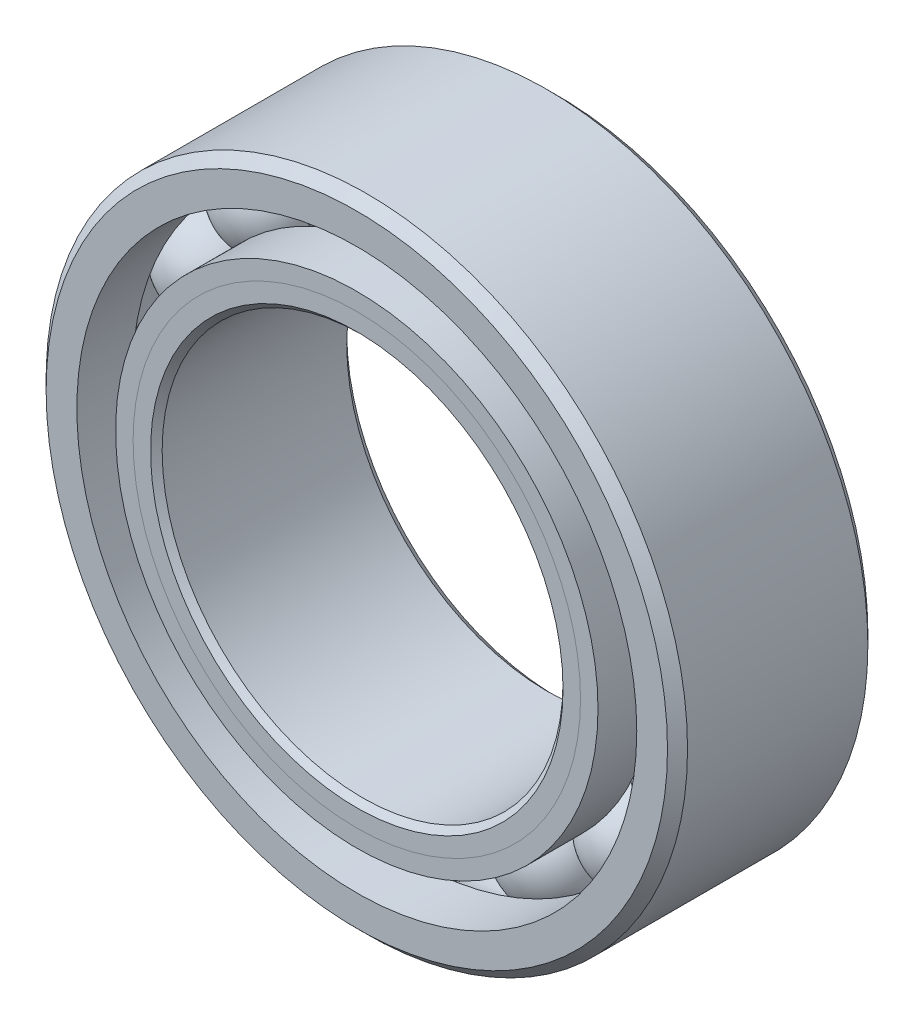
ISO-10303-21;
HEADER;
FILE_DESCRIPTION(('STEP AP214'),'2;1');
FILE_NAME('part.step','',(''),(''),'','','');
FILE_SCHEMA(('AUTOMOTIVE_DESIGN { 1 0 10303 214 1 1 1 1 }'));
ENDSEC;
DATA;
#1=APPLICATION_CONTEXT('core data for automotive mechanical design processes');
#2=APPLICATION_PROTOCOL_DEFINITION('international standard','automotive_design',2000,#1);
#3=PRODUCT_CONTEXT('',#1,'mechanical');
#4=PRODUCT('Part','Part','',(#3));
#5=PRODUCT_RELATED_PRODUCT_CATEGORY('part','',(#4));
#6=PRODUCT_DEFINITION_FORMATION('','',#4);
#7=PRODUCT_DEFINITION_CONTEXT('part definition',#1,'design');
#8=PRODUCT_DEFINITION('design','',#6,#7);
#9=PRODUCT_DEFINITION_SHAPE('','',#8);
#10=(LENGTH_UNIT() NAMED_UNIT(*) SI_UNIT(.MILLI.,.METRE.));
#11=(NAMED_UNIT(*) PLANE_ANGLE_UNIT() SI_UNIT($,.RADIAN.));
#12=(NAMED_UNIT(*) SI_UNIT($,.STERADIAN.) SOLID_ANGLE_UNIT());
#13=UNCERTAINTY_MEASURE_WITH_UNIT(LENGTH_MEASURE(1.E-05),#10,'distance_accuracy_value','');
#14=(GEOMETRIC_REPRESENTATION_CONTEXT(3) GLOBAL_UNCERTAINTY_ASSIGNED_CONTEXT((#13)) GLOBAL_UNIT_ASSIGNED_CONTEXT((#10,
#11,#12)) REPRESENTATION_CONTEXT('',''));
#15=CARTESIAN_POINT('',(0.,0.,0.));
#16=DIRECTION('',(0.,0.,1.));
#17=DIRECTION('',(1.,0.,0.));
#18=AXIS2_PLACEMENT_3D('',#15,#16,#17);
#19=CARTESIAN_POINT('',(-1.97440733385857,4.76664096305045,0.));
#20=DIRECTION('',(0.,0.,1.));
#21=DIRECTION('',(0.382683432365077,-0.923879532511292,0.));
#22=AXIS2_PLACEMENT_3D('',#19,#20,#21);
#23=SPHERICAL_SURFACE('',#22,0.961595974831125);
#24=CARTESIAN_POINT('',(-1.97440733385857,4.76664096305045,0.961595974831125));
#25=VERTEX_POINT('',#24);
#26=VERTEX_LOOP('',#25);
#27=FACE_BOUND('',#26,.T.);
#28=ADVANCED_FACE('F39',(#27),#23,.T.);
#29=CLOSED_SHELL('',(#28));
#30=MANIFOLD_SOLID_BREP('B2',#29);
#31=CARTESIAN_POINT('',(-3.6482290491843,3.64822904918439,0.));
#32=DIRECTION('',(0.,0.,1.));
#33=DIRECTION('',(0.707106781186539,-0.707106781186556,0.));
#34=AXIS2_PLACEMENT_3D('',#31,#32,#33);
#35=SPHERICAL_SURFACE('',#34,0.961595974831125);
#36=CARTESIAN_POINT('',(-3.6482290491843,3.64822904918439,0.961595974831125));
#37=VERTEX_POINT('',#36);
#38=VERTEX_LOOP('',#37);
#39=FACE_BOUND('',#38,.T.);
#40=ADVANCED_FACE('F59',(#39),#35,.T.);
#41=CLOSED_SHELL('',(#40));
#42=MANIFOLD_SOLID_BREP('B6',#41);
#43=CARTESIAN_POINT('',(-4.7666409630504,1.97440733385869,0.));
#44=DIRECTION('',(0.,0.,1.));
#45=DIRECTION('',(0.923879532511283,-0.3826834323651,0.));
#46=AXIS2_PLACEMENT_3D('',#43,#44,#45);
#47=SPHERICAL_SURFACE('',#46,0.961595974831125);
#48=CARTESIAN_POINT('',(-4.7666409630504,1.97440733385869,0.961595974831125));
#49=VERTEX_POINT('',#48);
#50=VERTEX_LOOP('',#49);
#51=FACE_BOUND('',#50,.T.);
#52=ADVANCED_FACE('F79',(#51),#47,.T.);
#53=CLOSED_SHELL('',(#52));
#54=MANIFOLD_SOLID_BREP('B35',#53);
#55=CARTESIAN_POINT('',(-5.159375,0.,0.));
#56=DIRECTION('',(0.,0.,1.));
#57=DIRECTION('',(1.,0.,0.));
#58=AXIS2_PLACEMENT_3D('',#55,#56,#57);
#59=SPHERICAL_SURFACE('',#58,0.961595974831125);
#60=CARTESIAN_POINT('',(-5.159375,0.,0.961595974831125));
#61=VERTEX_POINT('',#60);
#62=VERTEX_LOOP('',#61);
#63=FACE_BOUND('',#62,.T.);
#64=ADVANCED_FACE('F99',(#63),#59,.T.);
#65=CLOSED_SHELL('',(#64));
#66=MANIFOLD_SOLID_BREP('B55',#65);
#67=CARTESIAN_POINT('',(-4.76664096305044,-1.97440733385859,0.));
#68=DIRECTION('',(0.,0.,1.));
#69=DIRECTION('',(0.923879532511291,0.382683432365081,0.));
#70=AXIS2_PLACEMENT_3D('',#67,#68,#69);
#71=SPHERICAL_SURFACE('',#70,0.961595974831125);
#72=CARTESIAN_POINT('',(-4.76664096305044,-1.97440733385859,0.961595974831125));
#73=VERTEX_POINT('',#72);
#74=VERTEX_LOOP('',#73);
#75=FACE_BOUND('',#74,.T.);
#76=ADVANCED_FACE('F119',(#75),#71,.T.);
#77=CLOSED_SHELL('',(#76));
#78=MANIFOLD_SOLID_BREP('B75',#77);
#79=CARTESIAN_POINT('',(-3.64822904918437,-3.64822904918431,0.));
#80=DIRECTION('',(0.,0.,1.));
#81=DIRECTION('',(0.707106781186554,0.707106781186541,0.));
#82=AXIS2_PLACEMENT_3D('',#79,#80,#81);
#83=SPHERICAL_SURFACE('',#82,0.961595974831125);
#84=CARTESIAN_POINT('',(-3.64822904918437,-3.64822904918431,0.961595974831125));
#85=VERTEX_POINT('',#84);
#86=VERTEX_LOOP('',#85);
#87=FACE_BOUND('',#86,.T.);
#88=ADVANCED_FACE('F151',(#87),#83,.T.);
#89=CLOSED_SHELL('',(#88));
#90=MANIFOLD_SOLID_BREP('B95',#89);
#91=CARTESIAN_POINT('',(-1.97440733385867,-4.7666409630504,0.));
#92=DIRECTION('',(0.,0.,1.));
#93=DIRECTION('',(0.382683432365097,0.923879532511284,0.));
#94=AXIS2_PLACEMENT_3D('',#91,#92,#93);
#95=SPHERICAL_SURFACE('',#94,0.961595974831125);
#96=CARTESIAN_POINT('',(-1.97440733385867,-4.7666409630504,0.961595974831125));
#97=VERTEX_POINT('',#96);
#98=VERTEX_LOOP('',#97);
#99=FACE_BOUND('',#98,.T.);
#100=ADVANCED_FACE('F181',(#99),#95,.T.);
#101=CLOSED_SHELL('',(#100));
#102=MANIFOLD_SOLID_BREP('B115',#101);
#103=CARTESIAN_POINT('',(0.,-5.159375,0.));
#104=DIRECTION('',(0.,0.,1.));
#105=DIRECTION('',(0.,1.,0.));
#106=AXIS2_PLACEMENT_3D('',#103,#104,#105);
#107=SPHERICAL_SURFACE('',#106,0.961595974831125);
#108=CARTESIAN_POINT('',(0.,-5.159375,0.961595974831125));
#109=VERTEX_POINT('',#108);
#110=VERTEX_LOOP('',#109);
#111=FACE_BOUND('',#110,.T.);
#112=ADVANCED_FACE('F213',(#111),#107,.T.);
#113=CLOSED_SHELL('',(#112));
#114=MANIFOLD_SOLID_BREP('B147',#113);
#115=CARTESIAN_POINT('',(1.97440733385861,-4.76664096305043,0.));
#116=DIRECTION('',(0.,0.,1.));
#117=DIRECTION('',(-0.382683432365084,0.923879532511289,0.));
#118=AXIS2_PLACEMENT_3D('',#115,#116,#117);
#119=SPHERICAL_SURFACE('',#118,0.961595974831125);
#120=CARTESIAN_POINT('',(1.97440733385861,-4.76664096305043,0.961595974831125));
#121=VERTEX_POINT('',#120);
#122=VERTEX_LOOP('',#121);
#123=FACE_BOUND('',#122,.T.);
#124=ADVANCED_FACE('F245',(#123),#119,.T.);
#125=CLOSED_SHELL('',(#124));
#126=MANIFOLD_SOLID_BREP('B177',#125);
#127=CARTESIAN_POINT('',(3.64822904918432,-3.64822904918436,0.));
#128=DIRECTION('',(0.,0.,1.));
#129=DIRECTION('',(-0.707106781186544,0.707106781186551,0.));
#130=AXIS2_PLACEMENT_3D('',#127,#128,#129);
#131=SPHERICAL_SURFACE('',#130,0.961595974831125);
#132=CARTESIAN_POINT('',(3.64822904918432,-3.64822904918436,0.961595974831125));
#133=VERTEX_POINT('',#132);
#134=VERTEX_LOOP('',#133);
#135=FACE_BOUND('',#134,.T.);
#136=ADVANCED_FACE('F277',(#135),#131,.T.);
#137=CLOSED_SHELL('',(#136));
#138=MANIFOLD_SOLID_BREP('B209',#137);
#139=CARTESIAN_POINT('',(4.76664096305041,-1.97440733385866,0.));
#140=DIRECTION('',(0.,0.,1.));
#141=DIRECTION('',(-0.923879532511285,0.382683432365094,0.));
#142=AXIS2_PLACEMENT_3D('',#139,#140,#141);
#143=SPHERICAL_SURFACE('',#142,0.961595974831125);
#144=CARTESIAN_POINT('',(4.76664096305041,-1.97440733385866,0.961595974831125));
#145=VERTEX_POINT('',#144);
#146=VERTEX_LOOP('',#145);
#147=FACE_BOUND('',#146,.T.);
#148=ADVANCED_FACE('F307',(#147),#143,.T.);
#149=CLOSED_SHELL('',(#148));
#150=MANIFOLD_SOLID_BREP('B241',#149);
#151=CARTESIAN_POINT('',(5.159375,0.,0.));
#152=DIRECTION('',(0.,0.,1.));
#153=DIRECTION('',(-1.,0.,0.));
#154=AXIS2_PLACEMENT_3D('',#151,#152,#153);
#155=SPHERICAL_SURFACE('',#154,0.961595974831125);
#156=CARTESIAN_POINT('',(5.159375,0.,0.961595974831125));
#157=VERTEX_POINT('',#156);
#158=VERTEX_LOOP('',#157);
#159=FACE_BOUND('',#158,.T.);
#160=ADVANCED_FACE('F339',(#159),#155,.T.);
#161=CLOSED_SHELL('',(#160));
#162=MANIFOLD_SOLID_BREP('B273',#161);
#163=CARTESIAN_POINT('',(4.76664096305042,1.97440733385862,0.));
#164=DIRECTION('',(0.,0.,1.));
#165=DIRECTION('',(-0.923879532511288,-0.382683432365087,0.));
#166=AXIS2_PLACEMENT_3D('',#163,#164,#165);
#167=SPHERICAL_SURFACE('',#166,0.961595974831125);
#168=CARTESIAN_POINT('',(4.76664096305042,1.97440733385862,0.961595974831125));
#169=VERTEX_POINT('',#168);
#170=VERTEX_LOOP('',#169);
#171=FACE_BOUND('',#170,.T.);
#172=ADVANCED_FACE('F369',(#171),#167,.T.);
#173=CLOSED_SHELL('',(#172));
#174=MANIFOLD_SOLID_BREP('B303',#173);
#175=CARTESIAN_POINT('',(3.64822904918435,3.64822904918434,0.));
#176=DIRECTION('',(0.,0.,1.));
#177=DIRECTION('',(-0.707106781186549,-0.707106781186546,0.));
#178=AXIS2_PLACEMENT_3D('',#175,#176,#177);
#179=SPHERICAL_SURFACE('',#178,0.961595974831125);
#180=CARTESIAN_POINT('',(3.64822904918435,3.64822904918434,0.961595974831125));
#181=VERTEX_POINT('',#180);
#182=VERTEX_LOOP('',#181);
#183=FACE_BOUND('',#182,.T.);
#184=ADVANCED_FACE('F401',(#183),#179,.T.);
#185=CLOSED_SHELL('',(#184));
#186=MANIFOLD_SOLID_BREP('B335',#185);
#187=CARTESIAN_POINT('',(1.97440733385864,4.76664096305042,0.));
#188=DIRECTION('',(0.,0.,1.));
#189=DIRECTION('',(-0.382683432365091,-0.923879532511287,0.));
#190=AXIS2_PLACEMENT_3D('',#187,#188,#189);
#191=SPHERICAL_SURFACE('',#190,0.961595974831125);
#192=CARTESIAN_POINT('',(1.97440733385864,4.76664096305042,0.961595974831125));
#193=VERTEX_POINT('',#192);
#194=VERTEX_LOOP('',#193);
#195=FACE_BOUND('',#194,.T.);
#196=ADVANCED_FACE('F431',(#195),#191,.T.);
#197=CLOSED_SHELL('',(#196));
#198=MANIFOLD_SOLID_BREP('B365',#197);
#199=CARTESIAN_POINT('',(0.,5.159375,0.));
#200=DIRECTION('',(0.,0.,1.));
#201=DIRECTION('',(0.,-1.,0.));
#202=AXIS2_PLACEMENT_3D('',#199,#200,#201);
#203=SPHERICAL_SURFACE('',#202,0.961595974831125);
#204=CARTESIAN_POINT('',(0.,5.159375,0.961595974831125));
#205=VERTEX_POINT('',#204);
#206=VERTEX_LOOP('',#205);
#207=FACE_BOUND('',#206,.T.);
#208=ADVANCED_FACE('F463',(#207),#203,.T.);
#209=CLOSED_SHELL('',(#208));
#210=MANIFOLD_SOLID_BREP('B397',#209);
#211=CARTESIAN_POINT('',(0.,4.4293962398087,1.98374));
#212=DIRECTION('',(0.,0.,-1.));
#213=DIRECTION('',(-1.,0.,0.));
#214=AXIS2_PLACEMENT_3D('',#211,#212,#213);
#215=PLANE('',#214);
#216=CARTESIAN_POINT('',(0.,0.,1.98374));
#217=DIRECTION('',(0.,0.,1.));
#218=DIRECTION('',(1.,0.,0.));
#219=AXIS2_PLACEMENT_3D('',#216,#217,#218);
#220=CIRCLE('',#219,4.08326451258444);
#221=CARTESIAN_POINT('',(4.08326451258444,0.,1.98374));
#222=VERTEX_POINT('',#221);
#223=EDGE_CURVE('E517',#222,#222,#220,.T.);
#224=ORIENTED_EDGE('',*,*,#223,.F.);
#225=EDGE_LOOP('',(#224));
#226=FACE_BOUND('',#225,.T.);
#227=CARTESIAN_POINT('',(0.,0.,1.98374));
#228=DIRECTION('',(0.,0.,1.));
#229=DIRECTION('',(1.,0.,0.));
#230=AXIS2_PLACEMENT_3D('',#227,#228,#229);
#231=CIRCLE('',#230,4.4293962398087);
#232=CARTESIAN_POINT('',(4.4293962398087,0.,1.98374));
#233=VERTEX_POINT('',#232);
#234=EDGE_CURVE('E462',#233,#233,#231,.T.);
#235=ORIENTED_EDGE('',*,*,#234,.T.);
#236=EDGE_LOOP('',(#235));
#237=FACE_BOUND('',#236,.T.);
#238=ADVANCED_FACE('F483',(#226,#237),#215,.F.);
#239=CARTESIAN_POINT('',(0.,0.,1.63760827277574));
#240=DIRECTION('',(0.,0.,1.));
#241=DIRECTION('',(1.,0.,0.));
#242=AXIS2_PLACEMENT_3D('',#239,#240,#241);
#243=CONICAL_SURFACE('',#242,4.08326451258444,0.785398163397451);
#244=ORIENTED_EDGE('',*,*,#234,.F.);
#245=EDGE_LOOP('',(#244));
#246=FACE_BOUND('',#245,.T.);
#247=CARTESIAN_POINT('',(0.,0.,1.63760827277574));
#248=DIRECTION('',(0.,0.,1.));
#249=DIRECTION('',(1.,0.,0.));
#250=AXIS2_PLACEMENT_3D('',#247,#248,#249);
#251=CIRCLE('',#250,4.08326451258444);
#252=CARTESIAN_POINT('',(4.08326451258444,0.,1.63760827277574));
#253=VERTEX_POINT('',#252);
#254=EDGE_CURVE('E489',#253,#253,#251,.T.);
#255=ORIENTED_EDGE('',*,*,#254,.T.);
#256=EDGE_LOOP('',(#255));
#257=FACE_BOUND('',#256,.T.);
#258=ADVANCED_FACE('F524',(#246,#257),#243,.T.);
#259=CARTESIAN_POINT('',(0.,0.,1.98374));
#260=DIRECTION('',(0.,0.,1.));
#261=DIRECTION('',(1.,0.,0.));
#262=AXIS2_PLACEMENT_3D('',#259,#260,#261);
#263=CYLINDRICAL_SURFACE('',#262,4.08326451258444);
#264=ORIENTED_EDGE('',*,*,#254,.F.);
#265=EDGE_LOOP('',(#264));
#266=FACE_BOUND('',#265,.T.);
#267=CARTESIAN_POINT('',(0.,0.,0.));
#268=DIRECTION('',(0.,0.,1.));
#269=DIRECTION('',(1.,0.,0.));
#270=AXIS2_PLACEMENT_3D('',#267,#268,#269);
#271=CIRCLE('',#270,4.08326451258444);
#272=CARTESIAN_POINT('',(4.08326451258444,0.,0.));
#273=VERTEX_POINT('',#272);
#274=EDGE_CURVE('E493',#273,#273,#271,.T.);
#275=ORIENTED_EDGE('',*,*,#274,.T.);
#276=EDGE_LOOP('',(#275));
#277=FACE_BOUND('',#276,.T.);
#278=ADVANCED_FACE('F528',(#266,#277),#263,.T.);
#279=CARTESIAN_POINT('',(0.,4.08326451258444,0.));
#280=DIRECTION('',(0.,0.,-1.));
#281=DIRECTION('',(-1.,0.,0.));
#282=AXIS2_PLACEMENT_3D('',#279,#280,#281);
#283=PLANE('',#282);
#284=ORIENTED_EDGE('',*,*,#274,.F.);
#285=EDGE_LOOP('',(#284));
#286=FACE_BOUND('',#285,.T.);
#287=CARTESIAN_POINT('',(0.,0.,0.));
#288=DIRECTION('',(0.,0.,1.));
#289=DIRECTION('',(1.,0.,0.));
#290=AXIS2_PLACEMENT_3D('',#287,#288,#289);
#291=CIRCLE('',#290,4.19777902516888);
#292=CARTESIAN_POINT('',(4.19777902516888,0.,0.));
#293=VERTEX_POINT('',#292);
#294=EDGE_CURVE('E497',#293,#293,#291,.T.);
#295=ORIENTED_EDGE('',*,*,#294,.T.);
#296=EDGE_LOOP('',(#295));
#297=FACE_BOUND('',#296,.T.);
#298=ADVANCED_FACE('F533',(#286,#297),#283,.F.);
#299=CARTESIAN_POINT('',(0.,0.,0.));
#300=DIRECTION('',(0.,0.,1.));
#301=DIRECTION('',(1.,0.,0.));
#302=AXIS2_PLACEMENT_3D('',#299,#300,#301);
#303=TOROIDAL_SURFACE('',#302,5.159375,0.961595974831124);
#304=ORIENTED_EDGE('',*,*,#294,.F.);
#305=EDGE_LOOP('',(#304));
#306=FACE_BOUND('',#305,.T.);
#307=CARTESIAN_POINT('',(0.,0.,-0.881662222222222));
#308=DIRECTION('',(0.,0.,1.));
#309=DIRECTION('',(1.,0.,0.));
#310=AXIS2_PLACEMENT_3D('',#307,#308,#309);
#311=CIRCLE('',#310,4.77552796703297);
#312=CARTESIAN_POINT('',(4.77552796703297,0.,-0.881662222222222));
#313=VERTEX_POINT('',#312);
#314=EDGE_CURVE('E502',#313,#313,#311,.T.);
#315=ORIENTED_EDGE('',*,*,#314,.T.);
#316=EDGE_LOOP('',(#315));
#317=FACE_BOUND('',#316,.T.);
#318=ADVANCED_FACE('F539',(#306,#317),#303,.F.);
#319=CARTESIAN_POINT('',(0.,0.,1.98374));
#320=DIRECTION('',(0.,0.,1.));
#321=DIRECTION('',(1.,0.,0.));
#322=AXIS2_PLACEMENT_3D('',#319,#320,#321);
#323=CYLINDRICAL_SURFACE('',#322,4.77552796703297);
#324=ORIENTED_EDGE('',*,*,#314,.F.);
#325=EDGE_LOOP('',(#324));
#326=FACE_BOUND('',#325,.T.);
#327=CARTESIAN_POINT('',(0.,0.,-1.98374));
#328=DIRECTION('',(0.,0.,1.));
#329=DIRECTION('',(1.,0.,0.));
#330=AXIS2_PLACEMENT_3D('',#327,#328,#329);
#331=CIRCLE('',#330,4.77552796703297);
#332=CARTESIAN_POINT('',(4.77552796703297,0.,-1.98374));
#333=VERTEX_POINT('',#332);
#334=EDGE_CURVE('E505',#333,#333,#331,.T.);
#335=ORIENTED_EDGE('',*,*,#334,.T.);
#336=EDGE_LOOP('',(#335));
#337=FACE_BOUND('',#336,.T.);
#338=ADVANCED_FACE('F543',(#326,#337),#323,.T.);
#339=CARTESIAN_POINT('',(0.,4.167124,-1.98374));
#340=DIRECTION('',(0.,0.,1.));
#341=DIRECTION('',(1.,0.,0.));
#342=AXIS2_PLACEMENT_3D('',#339,#340,#341);
#343=PLANE('',#342);
#344=ORIENTED_EDGE('',*,*,#334,.F.);
#345=EDGE_LOOP('',(#344));
#346=FACE_BOUND('',#345,.T.);
#347=CARTESIAN_POINT('',(0.,0.,-1.98374));
#348=DIRECTION('',(0.,0.,1.));
#349=DIRECTION('',(1.,0.,0.));
#350=AXIS2_PLACEMENT_3D('',#347,#348,#349);
#351=CIRCLE('',#350,4.167124);
#352=CARTESIAN_POINT('',(4.167124,0.,-1.98374));
#353=VERTEX_POINT('',#352);
#354=EDGE_CURVE('E508',#353,#353,#351,.T.);
#355=ORIENTED_EDGE('',*,*,#354,.T.);
#356=EDGE_LOOP('',(#355));
#357=FACE_BOUND('',#356,.T.);
#358=ADVANCED_FACE('F547',(#346,#357),#343,.F.);
#359=CARTESIAN_POINT('',(0.,0.,-1.785366));
#360=DIRECTION('',(0.,0.,-1.));
#361=DIRECTION('',(-1.,0.,0.));
#362=AXIS2_PLACEMENT_3D('',#359,#360,#361);
#363=CONICAL_SURFACE('',#362,3.96875,0.78539816339745);
#364=ORIENTED_EDGE('',*,*,#354,.F.);
#365=EDGE_LOOP('',(#364));
#366=FACE_BOUND('',#365,.T.);
#367=CARTESIAN_POINT('',(0.,0.,-1.785366));
#368=DIRECTION('',(0.,0.,1.));
#369=DIRECTION('',(1.,0.,0.));
#370=AXIS2_PLACEMENT_3D('',#367,#368,#369);
#371=CIRCLE('',#370,3.96875);
#372=CARTESIAN_POINT('',(3.96875,0.,-1.785366));
#373=VERTEX_POINT('',#372);
#374=EDGE_CURVE('E511',#373,#373,#371,.T.);
#375=ORIENTED_EDGE('',*,*,#374,.T.);
#376=EDGE_LOOP('',(#375));
#377=FACE_BOUND('',#376,.T.);
#378=ADVANCED_FACE('F551',(#366,#377),#363,.F.);
#379=CARTESIAN_POINT('',(0.,0.,1.98374));
#380=DIRECTION('',(0.,0.,1.));
#381=DIRECTION('',(1.,0.,0.));
#382=AXIS2_PLACEMENT_3D('',#379,#380,#381);
#383=CYLINDRICAL_SURFACE('',#382,3.96875);
#384=ORIENTED_EDGE('',*,*,#374,.F.);
#385=EDGE_LOOP('',(#384));
#386=FACE_BOUND('',#385,.T.);
#387=CARTESIAN_POINT('',(0.,0.,1.86922548741556));
#388=DIRECTION('',(0.,0.,1.));
#389=DIRECTION('',(1.,0.,0.));
#390=AXIS2_PLACEMENT_3D('',#387,#388,#389);
#391=CIRCLE('',#390,3.96875);
#392=CARTESIAN_POINT('',(3.96875,0.,1.86922548741556));
#393=VERTEX_POINT('',#392);
#394=EDGE_CURVE('E514',#393,#393,#391,.T.);
#395=ORIENTED_EDGE('',*,*,#394,.T.);
#396=EDGE_LOOP('',(#395));
#397=FACE_BOUND('',#396,.T.);
#398=ADVANCED_FACE('F555',(#386,#397),#383,.F.);
#399=CARTESIAN_POINT('',(0.,0.,1.98374));
#400=DIRECTION('',(0.,0.,1.));
#401=DIRECTION('',(1.,0.,0.));
#402=AXIS2_PLACEMENT_3D('',#399,#400,#401);
#403=CONICAL_SURFACE('',#402,4.08326451258444,0.785398163397451);
#404=ORIENTED_EDGE('',*,*,#394,.F.);
#405=EDGE_LOOP('',(#404));
#406=FACE_BOUND('',#405,.T.);
#407=ORIENTED_EDGE('',*,*,#223,.T.);
#408=EDGE_LOOP('',(#407));
#409=FACE_BOUND('',#408,.T.);
#410=ADVANCED_FACE('F521',(#406,#409),#403,.F.);
#411=CLOSED_SHELL('',(#238,#258,#278,#298,#318,#338,#358,#378,#398,#410));
#412=MANIFOLD_SOLID_BREP('B427',#411);
#413=CARTESIAN_POINT('',(0.,4.77552796703297,1.98374));
#414=DIRECTION('',(0.,0.,-1.));
#415=DIRECTION('',(-1.,0.,0.));
#416=AXIS2_PLACEMENT_3D('',#413,#414,#415);
#417=PLANE('',#416);
#418=CARTESIAN_POINT('',(0.,0.,1.98374));
#419=DIRECTION('',(0.,0.,1.));
#420=DIRECTION('',(1.,0.,0.));
#421=AXIS2_PLACEMENT_3D('',#418,#419,#420);
#422=CIRCLE('',#421,4.4293962398087);
#423=CARTESIAN_POINT('',(4.4293962398087,0.,1.98374));
#424=VERTEX_POINT('',#423);
#425=EDGE_CURVE('E482',#424,#424,#422,.T.);
#426=ORIENTED_EDGE('',*,*,#425,.F.);
#427=EDGE_LOOP('',(#426));
#428=FACE_BOUND('',#427,.T.);
#429=CARTESIAN_POINT('',(0.,0.,1.98374));
#430=DIRECTION('',(0.,0.,1.));
#431=DIRECTION('',(1.,0.,0.));
#432=AXIS2_PLACEMENT_3D('',#429,#430,#431);
#433=CIRCLE('',#432,4.77552796703297);
#434=CARTESIAN_POINT('',(4.77552796703297,0.,1.98374));
#435=VERTEX_POINT('',#434);
#436=EDGE_CURVE('E663',#435,#435,#433,.T.);
#437=ORIENTED_EDGE('',*,*,#436,.T.);
#438=EDGE_LOOP('',(#437));
#439=FACE_BOUND('',#438,.T.);
#440=ADVANCED_FACE('F641',(#428,#439),#417,.F.);
#441=CARTESIAN_POINT('',(0.,0.,1.98374));
#442=DIRECTION('',(0.,0.,1.));
#443=DIRECTION('',(1.,0.,0.));
#444=AXIS2_PLACEMENT_3D('',#441,#442,#443);
#445=CONICAL_SURFACE('',#444,4.4293962398087,0.785398163397451);
#446=CARTESIAN_POINT('',(0.,0.,1.63760827277574));
#447=DIRECTION('',(0.,0.,1.));
#448=DIRECTION('',(1.,0.,0.));
#449=AXIS2_PLACEMENT_3D('',#446,#447,#448);
#450=CIRCLE('',#449,4.08326451258444);
#451=CARTESIAN_POINT('',(4.08326451258444,0.,1.63760827277574));
#452=VERTEX_POINT('',#451);
#453=EDGE_CURVE('E647',#452,#452,#450,.T.);
#454=ORIENTED_EDGE('',*,*,#453,.F.);
#455=EDGE_LOOP('',(#454));
#456=FACE_BOUND('',#455,.T.);
#457=ORIENTED_EDGE('',*,*,#425,.T.);
#458=EDGE_LOOP('',(#457));
#459=FACE_BOUND('',#458,.T.);
#460=ADVANCED_FACE('F688',(#456,#459),#445,.F.);
#461=CARTESIAN_POINT('',(0.,0.,1.98374));
#462=DIRECTION('',(0.,0.,1.));
#463=DIRECTION('',(1.,0.,0.));
#464=AXIS2_PLACEMENT_3D('',#461,#462,#463);
#465=CYLINDRICAL_SURFACE('',#464,4.08326451258444);
#466=CARTESIAN_POINT('',(0.,0.,0.));
#467=DIRECTION('',(0.,0.,1.));
#468=DIRECTION('',(1.,0.,0.));
#469=AXIS2_PLACEMENT_3D('',#466,#467,#468);
#470=CIRCLE('',#469,4.08326451258444);
#471=CARTESIAN_POINT('',(4.08326451258444,0.,0.));
#472=VERTEX_POINT('',#471);
#473=EDGE_CURVE('E651',#472,#472,#470,.T.);
#474=ORIENTED_EDGE('',*,*,#473,.F.);
#475=EDGE_LOOP('',(#474));
#476=FACE_BOUND('',#475,.T.);
#477=ORIENTED_EDGE('',*,*,#453,.T.);
#478=EDGE_LOOP('',(#477));
#479=FACE_BOUND('',#478,.T.);
#480=ADVANCED_FACE('F683',(#476,#479),#465,.F.);
#481=CARTESIAN_POINT('',(0.,4.08326451258444,0.));
#482=DIRECTION('',(0.,0.,1.));
#483=DIRECTION('',(1.,0.,0.));
#484=AXIS2_PLACEMENT_3D('',#481,#482,#483);
#485=PLANE('',#484);
#486=CARTESIAN_POINT('',(0.,0.,0.));
#487=DIRECTION('',(0.,0.,1.));
#488=DIRECTION('',(1.,0.,0.));
#489=AXIS2_PLACEMENT_3D('',#486,#487,#488);
#490=CIRCLE('',#489,4.19777902516888);
#491=CARTESIAN_POINT('',(4.19777902516888,0.,0.));
#492=VERTEX_POINT('',#491);
#493=EDGE_CURVE('E655',#492,#492,#490,.T.);
#494=ORIENTED_EDGE('',*,*,#493,.F.);
#495=EDGE_LOOP('',(#494));
#496=FACE_BOUND('',#495,.T.);
#497=ORIENTED_EDGE('',*,*,#473,.T.);
#498=EDGE_LOOP('',(#497));
#499=FACE_BOUND('',#498,.T.);
#500=ADVANCED_FACE('F677',(#496,#499),#485,.F.);
#501=CARTESIAN_POINT('',(0.,0.,0.));
#502=DIRECTION('',(0.,0.,1.));
#503=DIRECTION('',(1.,0.,0.));
#504=AXIS2_PLACEMENT_3D('',#501,#502,#503);
#505=TOROIDAL_SURFACE('',#504,5.159375,0.961595974831125);
#506=CARTESIAN_POINT('',(0.,0.,0.881662222222222));
#507=DIRECTION('',(0.,0.,1.));
#508=DIRECTION('',(1.,0.,0.));
#509=AXIS2_PLACEMENT_3D('',#506,#507,#508);
#510=CIRCLE('',#509,4.77552796703297);
#511=CARTESIAN_POINT('',(4.77552796703297,0.,0.881662222222222));
#512=VERTEX_POINT('',#511);
#513=EDGE_CURVE('E660',#512,#512,#510,.T.);
#514=ORIENTED_EDGE('',*,*,#513,.F.);
#515=EDGE_LOOP('',(#514));
#516=FACE_BOUND('',#515,.T.);
#517=ORIENTED_EDGE('',*,*,#493,.T.);
#518=EDGE_LOOP('',(#517));
#519=FACE_BOUND('',#518,.T.);
#520=ADVANCED_FACE('F671',(#516,#519),#505,.F.);
#521=CARTESIAN_POINT('',(0.,0.,1.98374));
#522=DIRECTION('',(0.,0.,1.));
#523=DIRECTION('',(1.,0.,0.));
#524=AXIS2_PLACEMENT_3D('',#521,#522,#523);
#525=CYLINDRICAL_SURFACE('',#524,4.77552796703297);
#526=ORIENTED_EDGE('',*,*,#436,.F.);
#527=EDGE_LOOP('',(#526));
#528=FACE_BOUND('',#527,.T.);
#529=ORIENTED_EDGE('',*,*,#513,.T.);
#530=EDGE_LOOP('',(#529));
#531=FACE_BOUND('',#530,.T.);
#532=ADVANCED_FACE('F668',(#528,#531),#525,.T.);
#533=CLOSED_SHELL('',(#440,#460,#480,#500,#520,#532));
#534=MANIFOLD_SOLID_BREP('B457',#533);
#535=CARTESIAN_POINT('',(0.,0.,1.785366));
#536=DIRECTION('',(0.,0.,-1.));
#537=DIRECTION('',(-1.,0.,0.));
#538=AXIS2_PLACEMENT_3D('',#535,#536,#537);
#539=CONICAL_SURFACE('',#538,6.35,0.785398163397449);
#540=CARTESIAN_POINT('',(0.,0.,1.98374));
#541=DIRECTION('',(0.,0.,1.));
#542=DIRECTION('',(1.,0.,0.));
#543=AXIS2_PLACEMENT_3D('',#540,#541,#542);
#544=CIRCLE('',#543,6.151626);
#545=CARTESIAN_POINT('',(6.151626,0.,1.98374));
#546=VERTEX_POINT('',#545);
#547=EDGE_CURVE('E760',#546,#546,#544,.T.);
#548=ORIENTED_EDGE('',*,*,#547,.F.);
#549=EDGE_LOOP('',(#548));
#550=FACE_BOUND('',#549,.T.);
#551=CARTESIAN_POINT('',(0.,0.,1.785366));
#552=DIRECTION('',(0.,0.,1.));
#553=DIRECTION('',(1.,0.,0.));
#554=AXIS2_PLACEMENT_3D('',#551,#552,#553);
#555=CIRCLE('',#554,6.35);
#556=CARTESIAN_POINT('',(6.35,0.,1.785366));
#557=VERTEX_POINT('',#556);
#558=EDGE_CURVE('E640',#557,#557,#555,.T.);
#559=ORIENTED_EDGE('',*,*,#558,.T.);
#560=EDGE_LOOP('',(#559));
#561=FACE_BOUND('',#560,.T.);
#562=ADVANCED_FACE('F732',(#550,#561),#539,.T.);
#563=CARTESIAN_POINT('',(0.,0.,1.98374));
#564=DIRECTION('',(0.,0.,1.));
#565=DIRECTION('',(1.,0.,0.));
#566=AXIS2_PLACEMENT_3D('',#563,#564,#565);
#567=CYLINDRICAL_SURFACE('',#566,6.35);
#568=ORIENTED_EDGE('',*,*,#558,.F.);
#569=EDGE_LOOP('',(#568));
#570=FACE_BOUND('',#569,.T.);
#571=CARTESIAN_POINT('',(0.,0.,-1.785366));
#572=DIRECTION('',(0.,0.,1.));
#573=DIRECTION('',(1.,0.,0.));
#574=AXIS2_PLACEMENT_3D('',#571,#572,#573);
#575=CIRCLE('',#574,6.35);
#576=CARTESIAN_POINT('',(6.35,0.,-1.785366));
#577=VERTEX_POINT('',#576);
#578=EDGE_CURVE('E738',#577,#577,#575,.T.);
#579=ORIENTED_EDGE('',*,*,#578,.T.);
#580=EDGE_LOOP('',(#579));
#581=FACE_BOUND('',#580,.T.);
#582=ADVANCED_FACE('F767',(#570,#581),#567,.T.);
#583=CARTESIAN_POINT('',(0.,0.,-1.98374));
#584=DIRECTION('',(0.,0.,1.));
#585=DIRECTION('',(1.,0.,0.));
#586=AXIS2_PLACEMENT_3D('',#583,#584,#585);
#587=CONICAL_SURFACE('',#586,6.151626,0.785398163397448);
#588=ORIENTED_EDGE('',*,*,#578,.F.);
#589=EDGE_LOOP('',(#588));
#590=FACE_BOUND('',#589,.T.);
#591=CARTESIAN_POINT('',(0.,0.,-1.98374));
#592=DIRECTION('',(0.,0.,1.));
#593=DIRECTION('',(1.,0.,0.));
#594=AXIS2_PLACEMENT_3D('',#591,#592,#593);
#595=CIRCLE('',#594,6.151626);
#596=CARTESIAN_POINT('',(6.151626,0.,-1.98374));
#597=VERTEX_POINT('',#596);
#598=EDGE_CURVE('E742',#597,#597,#595,.T.);
#599=ORIENTED_EDGE('',*,*,#598,.T.);
#600=EDGE_LOOP('',(#599));
#601=FACE_BOUND('',#600,.T.);
#602=ADVANCED_FACE('F771',(#590,#601),#587,.T.);
#603=CARTESIAN_POINT('',(0.,6.151626,-1.98374));
#604=DIRECTION('',(0.,0.,1.));
#605=DIRECTION('',(1.,0.,0.));
#606=AXIS2_PLACEMENT_3D('',#603,#604,#605);
#607=PLANE('',#606);
#608=ORIENTED_EDGE('',*,*,#598,.F.);
#609=EDGE_LOOP('',(#608));
#610=FACE_BOUND('',#609,.T.);
#611=CARTESIAN_POINT('',(0.,0.,-1.98374));
#612=DIRECTION('',(0.,0.,1.));
#613=DIRECTION('',(1.,0.,0.));
#614=AXIS2_PLACEMENT_3D('',#611,#612,#613);
#615=CIRCLE('',#614,5.54322203296703);
#616=CARTESIAN_POINT('',(5.54322203296703,0.,-1.98374));
#617=VERTEX_POINT('',#616);
#618=EDGE_CURVE('E746',#617,#617,#615,.T.);
#619=ORIENTED_EDGE('',*,*,#618,.T.);
#620=EDGE_LOOP('',(#619));
#621=FACE_BOUND('',#620,.T.);
#622=ADVANCED_FACE('F776',(#610,#621),#607,.F.);
#623=CARTESIAN_POINT('',(0.,0.,1.98374));
#624=DIRECTION('',(0.,0.,1.));
#625=DIRECTION('',(1.,0.,0.));
#626=AXIS2_PLACEMENT_3D('',#623,#624,#625);
#627=CYLINDRICAL_SURFACE('',#626,5.54322203296703);
#628=ORIENTED_EDGE('',*,*,#618,.F.);
#629=EDGE_LOOP('',(#628));
#630=FACE_BOUND('',#629,.T.);
#631=CARTESIAN_POINT('',(0.,0.,-0.881662222222222));
#632=DIRECTION('',(0.,0.,1.));
#633=DIRECTION('',(1.,0.,0.));
#634=AXIS2_PLACEMENT_3D('',#631,#632,#633);
#635=CIRCLE('',#634,5.54322203296703);
#636=CARTESIAN_POINT('',(5.54322203296703,0.,-0.881662222222222));
#637=VERTEX_POINT('',#636);
#638=EDGE_CURVE('E751',#637,#637,#635,.T.);
#639=ORIENTED_EDGE('',*,*,#638,.T.);
#640=EDGE_LOOP('',(#639));
#641=FACE_BOUND('',#640,.T.);
#642=ADVANCED_FACE('F782',(#630,#641),#627,.F.);
#643=CARTESIAN_POINT('',(0.,0.,0.));
#644=DIRECTION('',(0.,0.,1.));
#645=DIRECTION('',(1.,0.,0.));
#646=AXIS2_PLACEMENT_3D('',#643,#644,#645);
#647=TOROIDAL_SURFACE('',#646,5.159375,0.961595974831125);
#648=ORIENTED_EDGE('',*,*,#638,.F.);
#649=EDGE_LOOP('',(#648));
#650=FACE_BOUND('',#649,.T.);
#651=CARTESIAN_POINT('',(0.,0.,0.881662222222222));
#652=DIRECTION('',(0.,0.,1.));
#653=DIRECTION('',(1.,0.,0.));
#654=AXIS2_PLACEMENT_3D('',#651,#652,#653);
#655=CIRCLE('',#654,5.54322203296703);
#656=CARTESIAN_POINT('',(5.54322203296703,0.,0.881662222222222));
#657=VERTEX_POINT('',#656);
#658=EDGE_CURVE('E754',#657,#657,#655,.T.);
#659=ORIENTED_EDGE('',*,*,#658,.T.);
#660=EDGE_LOOP('',(#659));
#661=FACE_BOUND('',#660,.T.);
#662=ADVANCED_FACE('F786',(#650,#661),#647,.F.);
#663=CARTESIAN_POINT('',(0.,0.,1.98374));
#664=DIRECTION('',(0.,0.,1.));
#665=DIRECTION('',(1.,0.,0.));
#666=AXIS2_PLACEMENT_3D('',#663,#664,#665);
#667=CYLINDRICAL_SURFACE('',#666,5.54322203296703);
#668=ORIENTED_EDGE('',*,*,#658,.F.);
#669=EDGE_LOOP('',(#668));
#670=FACE_BOUND('',#669,.T.);
#671=CARTESIAN_POINT('',(0.,0.,1.98374));
#672=DIRECTION('',(0.,0.,1.));
#673=DIRECTION('',(1.,0.,0.));
#674=AXIS2_PLACEMENT_3D('',#671,#672,#673);
#675=CIRCLE('',#674,5.54322203296703);
#676=CARTESIAN_POINT('',(5.54322203296703,0.,1.98374));
#677=VERTEX_POINT('',#676);
#678=EDGE_CURVE('E757',#677,#677,#675,.T.);
#679=ORIENTED_EDGE('',*,*,#678,.T.);
#680=EDGE_LOOP('',(#679));
#681=FACE_BOUND('',#680,.T.);
#682=ADVANCED_FACE('F790',(#670,#681),#667,.F.);
#683=CARTESIAN_POINT('',(0.,6.151626,1.98374));
#684=DIRECTION('',(0.,0.,-1.));
#685=DIRECTION('',(-1.,0.,0.));
#686=AXIS2_PLACEMENT_3D('',#683,#684,#685);
#687=PLANE('',#686);
#688=ORIENTED_EDGE('',*,*,#678,.F.);
#689=EDGE_LOOP('',(#688));
#690=FACE_BOUND('',#689,.T.);
#691=ORIENTED_EDGE('',*,*,#547,.T.);
#692=EDGE_LOOP('',(#691));
#693=FACE_BOUND('',#692,.T.);
#694=ADVANCED_FACE('F764',(#690,#693),#687,.F.);
#695=CLOSED_SHELL('',(#562,#582,#602,#622,#642,#662,#682,#694));
#696=MANIFOLD_SOLID_BREP('B477',#695);
#697=ADVANCED_BREP_SHAPE_REPRESENTATION('',(#18,#30,#42,#54,#66,#78,#90,#102,#114,#126,#138,
#150,#162,#174,#186,#198,#210,#412,#534,#696),#14);
#698=SHAPE_DEFINITION_REPRESENTATION(#9,#697);
ENDSEC;
END-ISO-10303-21;
